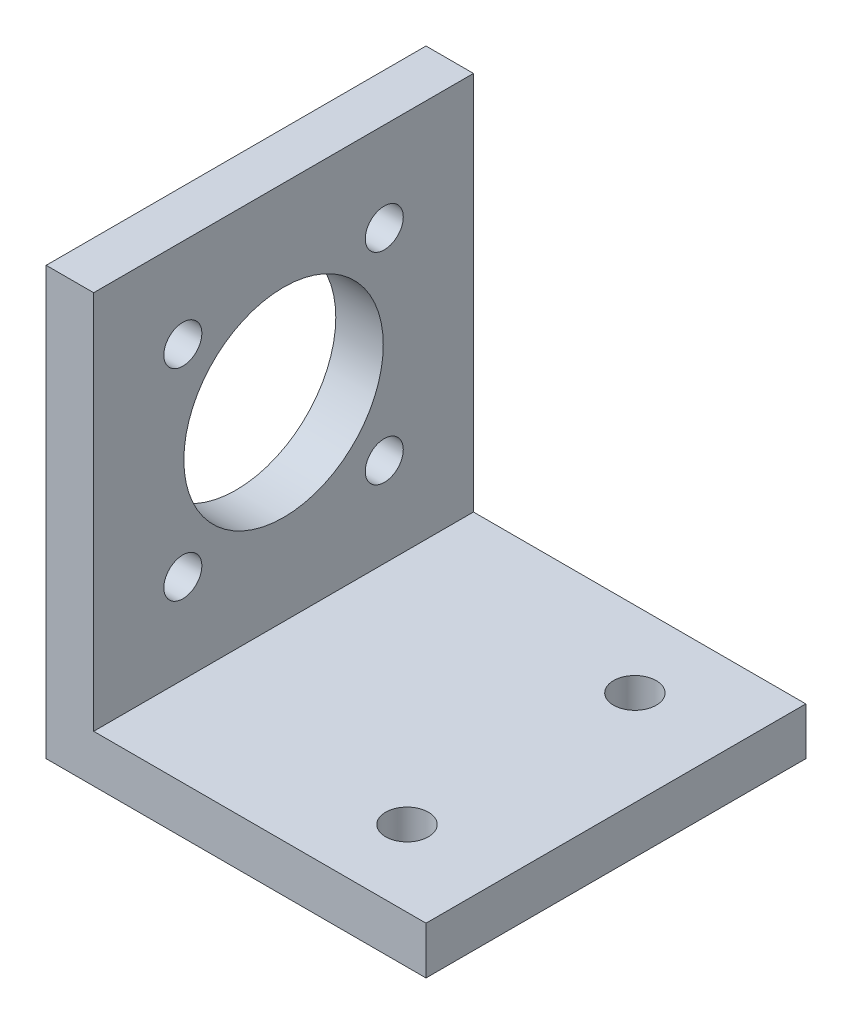
ISO-10303-21;
HEADER;
FILE_DESCRIPTION(('STEP AP214'),'2;1');
FILE_NAME('part.step','',(''),(''),'','','');
FILE_SCHEMA(('AUTOMOTIVE_DESIGN { 1 0 10303 214 1 1 1 1 }'));
ENDSEC;
DATA;
#1=APPLICATION_CONTEXT('core data for automotive mechanical design processes');
#2=APPLICATION_PROTOCOL_DEFINITION('international standard','automotive_design',2000,#1);
#3=PRODUCT_CONTEXT('',#1,'mechanical');
#4=PRODUCT('Part','Part','',(#3));
#5=PRODUCT_RELATED_PRODUCT_CATEGORY('part','',(#4));
#6=PRODUCT_DEFINITION_FORMATION('','',#4);
#7=PRODUCT_DEFINITION_CONTEXT('part definition',#1,'design');
#8=PRODUCT_DEFINITION('design','',#6,#7);
#9=PRODUCT_DEFINITION_SHAPE('','',#8);
#10=(LENGTH_UNIT() NAMED_UNIT(*) SI_UNIT(.MILLI.,.METRE.));
#11=(NAMED_UNIT(*) PLANE_ANGLE_UNIT() SI_UNIT($,.RADIAN.));
#12=(NAMED_UNIT(*) SI_UNIT($,.STERADIAN.) SOLID_ANGLE_UNIT());
#13=UNCERTAINTY_MEASURE_WITH_UNIT(LENGTH_MEASURE(1.E-05),#10,'distance_accuracy_value','');
#14=(GEOMETRIC_REPRESENTATION_CONTEXT(3) GLOBAL_UNCERTAINTY_ASSIGNED_CONTEXT((#13)) GLOBAL_UNIT_ASSIGNED_CONTEXT((#10,
#11,#12)) REPRESENTATION_CONTEXT('',''));
#15=CARTESIAN_POINT('',(0.,0.,0.));
#16=DIRECTION('',(0.,0.,1.));
#17=DIRECTION('',(1.,0.,0.));
#18=AXIS2_PLACEMENT_3D('',#15,#16,#17);
#19=CARTESIAN_POINT('',(0.,5.,0.));
#20=DIRECTION('',(0.,-1.,0.));
#21=DIRECTION('',(0.,0.,-1.));
#22=AXIS2_PLACEMENT_3D('',#19,#20,#21);
#23=PLANE('',#22);
#24=CARTESIAN_POINT('',(10.,5.,-12.));
#25=DIRECTION('',(0.,1.,0.));
#26=DIRECTION('',(0.,0.,1.));
#27=AXIS2_PLACEMENT_3D('',#24,#25,#26);
#28=CIRCLE('',#27,2.25);
#29=CARTESIAN_POINT('',(10.,5.,-9.75));
#30=VERTEX_POINT('',#29);
#31=EDGE_CURVE('E157',#30,#30,#28,.T.);
#32=ORIENTED_EDGE('',*,*,#31,.F.);
#33=EDGE_LOOP('',(#32));
#34=FACE_BOUND('',#33,.T.);
#35=CARTESIAN_POINT('',(10.,5.,12.));
#36=DIRECTION('',(0.,1.,0.));
#37=DIRECTION('',(0.,0.,-1.));
#38=AXIS2_PLACEMENT_3D('',#35,#36,#37);
#39=CIRCLE('',#38,2.25);
#40=CARTESIAN_POINT('',(10.,5.,9.75));
#41=VERTEX_POINT('',#40);
#42=EDGE_CURVE('E153',#41,#41,#39,.T.);
#43=ORIENTED_EDGE('',*,*,#42,.F.);
#44=EDGE_LOOP('',(#43));
#45=FACE_BOUND('',#44,.T.);
#46=DIRECTION('',(0.,0.,-1.));
#47=VECTOR('',#46,1.);
#48=CARTESIAN_POINT('',(-15.,5.,-20.));
#49=LINE('',#48,#47);
#50=CARTESIAN_POINT('',(-15.,5.,20.));
#51=VERTEX_POINT('',#50);
#52=CARTESIAN_POINT('',(-15.,5.,-20.));
#53=VERTEX_POINT('',#52);
#54=EDGE_CURVE('E52',#51,#53,#49,.T.);
#55=ORIENTED_EDGE('',*,*,#54,.F.);
#56=DIRECTION('',(1.,0.,0.));
#57=VECTOR('',#56,1.);
#58=CARTESIAN_POINT('',(-20.,5.,20.));
#59=LINE('',#58,#57);
#60=CARTESIAN_POINT('',(20.,5.,20.));
#61=VERTEX_POINT('',#60);
#62=EDGE_CURVE('E57',#51,#61,#59,.T.);
#63=ORIENTED_EDGE('',*,*,#62,.T.);
#64=DIRECTION('',(0.,0.,-1.));
#65=VECTOR('',#64,1.);
#66=CARTESIAN_POINT('',(20.,5.,20.));
#67=LINE('',#66,#65);
#68=CARTESIAN_POINT('',(20.,5.,-20.));
#69=VERTEX_POINT('',#68);
#70=EDGE_CURVE('E88',#61,#69,#67,.T.);
#71=ORIENTED_EDGE('',*,*,#70,.T.);
#72=DIRECTION('',(-1.,0.,0.));
#73=VECTOR('',#72,1.);
#74=CARTESIAN_POINT('',(-20.,5.,-20.));
#75=LINE('',#74,#73);
#76=EDGE_CURVE('E139',#69,#53,#75,.T.);
#77=ORIENTED_EDGE('',*,*,#76,.T.);
#78=EDGE_LOOP('',(#55,#63,#71,#77));
#79=FACE_BOUND('',#78,.T.);
#80=ADVANCED_FACE('F37',(#34,#45,#79),#23,.F.);
#81=CARTESIAN_POINT('',(20.,5.,20.));
#82=DIRECTION('',(-1.,0.,0.));
#83=DIRECTION('',(0.,0.,1.));
#84=AXIS2_PLACEMENT_3D('',#81,#82,#83);
#85=PLANE('',#84);
#86=DIRECTION('',(0.,0.,-1.));
#87=VECTOR('',#86,1.);
#88=CARTESIAN_POINT('',(20.,0.,20.));
#89=LINE('',#88,#87);
#90=CARTESIAN_POINT('',(20.,0.,20.));
#91=VERTEX_POINT('',#90);
#92=CARTESIAN_POINT('',(20.,0.,-20.));
#93=VERTEX_POINT('',#92);
#94=EDGE_CURVE('E94',#91,#93,#89,.T.);
#95=ORIENTED_EDGE('',*,*,#94,.T.);
#96=DIRECTION('',(0.,-1.,0.));
#97=VECTOR('',#96,1.);
#98=CARTESIAN_POINT('',(20.,5.,-20.));
#99=LINE('',#98,#97);
#100=EDGE_CURVE('E11',#69,#93,#99,.T.);
#101=ORIENTED_EDGE('',*,*,#100,.F.);
#102=ORIENTED_EDGE('',*,*,#70,.F.);
#103=DIRECTION('',(0.,-1.,0.));
#104=VECTOR('',#103,1.);
#105=CARTESIAN_POINT('',(20.,5.,20.));
#106=LINE('',#105,#104);
#107=EDGE_CURVE('E80',#61,#91,#106,.T.);
#108=ORIENTED_EDGE('',*,*,#107,.T.);
#109=EDGE_LOOP('',(#95,#101,#102,#108));
#110=FACE_BOUND('',#109,.T.);
#111=ADVANCED_FACE('F39',(#110),#85,.F.);
#112=CARTESIAN_POINT('',(-20.,5.,-20.));
#113=DIRECTION('',(0.,0.,1.));
#114=DIRECTION('',(1.,0.,0.));
#115=AXIS2_PLACEMENT_3D('',#112,#113,#114);
#116=PLANE('',#115);
#117=DIRECTION('',(-1.,0.,0.));
#118=VECTOR('',#117,1.);
#119=CARTESIAN_POINT('',(-20.,0.,-20.));
#120=LINE('',#119,#118);
#121=CARTESIAN_POINT('',(-20.,0.,-20.));
#122=VERTEX_POINT('',#121);
#123=EDGE_CURVE('E97',#93,#122,#120,.T.);
#124=ORIENTED_EDGE('',*,*,#123,.T.);
#125=DIRECTION('',(0.,-1.,0.));
#126=VECTOR('',#125,1.);
#127=CARTESIAN_POINT('',(-20.,5.,-20.));
#128=LINE('',#127,#126);
#129=CARTESIAN_POINT('',(-20.,45.,-20.));
#130=VERTEX_POINT('',#129);
#131=EDGE_CURVE('E45',#130,#122,#128,.T.);
#132=ORIENTED_EDGE('',*,*,#131,.F.);
#133=DIRECTION('',(-1.,0.,0.));
#134=VECTOR('',#133,1.);
#135=CARTESIAN_POINT('',(-20.,45.,-20.));
#136=LINE('',#135,#134);
#137=CARTESIAN_POINT('',(-15.,45.,-20.));
#138=VERTEX_POINT('',#137);
#139=EDGE_CURVE('E121',#138,#130,#136,.T.);
#140=ORIENTED_EDGE('',*,*,#139,.F.);
#141=DIRECTION('',(0.,-1.,0.));
#142=VECTOR('',#141,1.);
#143=CARTESIAN_POINT('',(-15.,45.,-20.));
#144=LINE('',#143,#142);
#145=EDGE_CURVE('E102',#138,#53,#144,.T.);
#146=ORIENTED_EDGE('',*,*,#145,.T.);
#147=ORIENTED_EDGE('',*,*,#76,.F.);
#148=ORIENTED_EDGE('',*,*,#100,.T.);
#149=EDGE_LOOP('',(#124,#132,#140,#146,#147,#148));
#150=FACE_BOUND('',#149,.T.);
#151=ADVANCED_FACE('F118',(#150),#116,.F.);
#152=CARTESIAN_POINT('',(-20.,5.,20.));
#153=DIRECTION('',(1.,0.,0.));
#154=DIRECTION('',(0.,0.,-1.));
#155=AXIS2_PLACEMENT_3D('',#152,#153,#154);
#156=PLANE('',#155);
#157=CARTESIAN_POINT('',(-20.,35.6066017177982,-10.6066017177982));
#158=DIRECTION('',(1.,0.,0.));
#159=DIRECTION('',(0.,0.,-1.));
#160=AXIS2_PLACEMENT_3D('',#157,#158,#159);
#161=CIRCLE('',#160,2.);
#162=CARTESIAN_POINT('',(-20.,35.6066017177982,-12.6066017177982));
#163=VERTEX_POINT('',#162);
#164=EDGE_CURVE('E175',#163,#163,#161,.T.);
#165=ORIENTED_EDGE('',*,*,#164,.T.);
#166=EDGE_LOOP('',(#165));
#167=FACE_BOUND('',#166,.T.);
#168=CARTESIAN_POINT('',(-20.,14.3933982822018,-10.6066017177982));
#169=DIRECTION('',(1.,0.,0.));
#170=DIRECTION('',(0.,0.,-1.));
#171=AXIS2_PLACEMENT_3D('',#168,#169,#170);
#172=CIRCLE('',#171,2.);
#173=CARTESIAN_POINT('',(-20.,14.3933982822018,-12.6066017177982));
#174=VERTEX_POINT('',#173);
#175=EDGE_CURVE('E168',#174,#174,#172,.T.);
#176=ORIENTED_EDGE('',*,*,#175,.T.);
#177=EDGE_LOOP('',(#176));
#178=FACE_BOUND('',#177,.T.);
#179=CARTESIAN_POINT('',(-20.,25.,0.));
#180=DIRECTION('',(1.,0.,0.));
#181=DIRECTION('',(0.,0.,-1.));
#182=AXIS2_PLACEMENT_3D('',#179,#180,#181);
#183=CIRCLE('',#182,10.5);
#184=CARTESIAN_POINT('',(-20.,25.,-10.5));
#185=VERTEX_POINT('',#184);
#186=EDGE_CURVE('E186',#185,#185,#183,.T.);
#187=ORIENTED_EDGE('',*,*,#186,.T.);
#188=EDGE_LOOP('',(#187));
#189=FACE_BOUND('',#188,.T.);
#190=CARTESIAN_POINT('',(-20.,14.3933982822018,10.6066017177982));
#191=DIRECTION('',(1.,0.,0.));
#192=DIRECTION('',(0.,0.,-1.));
#193=AXIS2_PLACEMENT_3D('',#190,#191,#192);
#194=CIRCLE('',#193,2.);
#195=CARTESIAN_POINT('',(-20.,14.3933982822018,8.60660171779822));
#196=VERTEX_POINT('',#195);
#197=EDGE_CURVE('E180',#196,#196,#194,.T.);
#198=ORIENTED_EDGE('',*,*,#197,.T.);
#199=EDGE_LOOP('',(#198));
#200=FACE_BOUND('',#199,.T.);
#201=CARTESIAN_POINT('',(-20.,35.6066017177982,10.6066017177982));
#202=DIRECTION('',(1.,0.,0.));
#203=DIRECTION('',(0.,0.,-1.));
#204=AXIS2_PLACEMENT_3D('',#201,#202,#203);
#205=CIRCLE('',#204,2.);
#206=CARTESIAN_POINT('',(-20.,35.6066017177982,8.60660171779822));
#207=VERTEX_POINT('',#206);
#208=EDGE_CURVE('E154',#207,#207,#205,.T.);
#209=ORIENTED_EDGE('',*,*,#208,.T.);
#210=EDGE_LOOP('',(#209));
#211=FACE_BOUND('',#210,.T.);
#212=DIRECTION('',(0.,0.,1.));
#213=VECTOR('',#212,1.);
#214=CARTESIAN_POINT('',(-20.,0.,20.));
#215=LINE('',#214,#213);
#216=CARTESIAN_POINT('',(-20.,0.,20.));
#217=VERTEX_POINT('',#216);
#218=EDGE_CURVE('E89',#122,#217,#215,.T.);
#219=ORIENTED_EDGE('',*,*,#218,.T.);
#220=DIRECTION('',(0.,-1.,0.));
#221=VECTOR('',#220,1.);
#222=CARTESIAN_POINT('',(-20.,5.,20.));
#223=LINE('',#222,#221);
#224=CARTESIAN_POINT('',(-20.,45.,20.));
#225=VERTEX_POINT('',#224);
#226=EDGE_CURVE('E84',#225,#217,#223,.T.);
#227=ORIENTED_EDGE('',*,*,#226,.F.);
#228=DIRECTION('',(0.,0.,1.));
#229=VECTOR('',#228,1.);
#230=CARTESIAN_POINT('',(-20.,45.,-20.));
#231=LINE('',#230,#229);
#232=EDGE_CURVE('E114',#130,#225,#231,.T.);
#233=ORIENTED_EDGE('',*,*,#232,.F.);
#234=ORIENTED_EDGE('',*,*,#131,.T.);
#235=EDGE_LOOP('',(#219,#227,#233,#234));
#236=FACE_BOUND('',#235,.T.);
#237=ADVANCED_FACE('F112',(#167,#178,#189,#200,#211,#236),#156,.F.);
#238=CARTESIAN_POINT('',(-20.,5.,20.));
#239=DIRECTION('',(0.,0.,-1.));
#240=DIRECTION('',(-1.,0.,0.));
#241=AXIS2_PLACEMENT_3D('',#238,#239,#240);
#242=PLANE('',#241);
#243=DIRECTION('',(1.,0.,0.));
#244=VECTOR('',#243,1.);
#245=CARTESIAN_POINT('',(-20.,0.,20.));
#246=LINE('',#245,#244);
#247=EDGE_CURVE('E77',#217,#91,#246,.T.);
#248=ORIENTED_EDGE('',*,*,#247,.T.);
#249=ORIENTED_EDGE('',*,*,#107,.F.);
#250=ORIENTED_EDGE('',*,*,#62,.F.);
#251=DIRECTION('',(0.,-1.,0.));
#252=VECTOR('',#251,1.);
#253=CARTESIAN_POINT('',(-15.,45.,20.));
#254=LINE('',#253,#252);
#255=CARTESIAN_POINT('',(-15.,45.,20.));
#256=VERTEX_POINT('',#255);
#257=EDGE_CURVE('E98',#256,#51,#254,.T.);
#258=ORIENTED_EDGE('',*,*,#257,.F.);
#259=DIRECTION('',(1.,0.,0.));
#260=VECTOR('',#259,1.);
#261=CARTESIAN_POINT('',(-20.,45.,20.));
#262=LINE('',#261,#260);
#263=EDGE_CURVE('E133',#225,#256,#262,.T.);
#264=ORIENTED_EDGE('',*,*,#263,.F.);
#265=ORIENTED_EDGE('',*,*,#226,.T.);
#266=EDGE_LOOP('',(#248,#249,#250,#258,#264,#265));
#267=FACE_BOUND('',#266,.T.);
#268=ADVANCED_FACE('F79',(#267),#242,.F.);
#269=CARTESIAN_POINT('',(0.,0.,0.));
#270=DIRECTION('',(0.,-1.,0.));
#271=DIRECTION('',(0.,0.,-1.));
#272=AXIS2_PLACEMENT_3D('',#269,#270,#271);
#273=PLANE('',#272);
#274=CARTESIAN_POINT('',(10.,0.,-12.));
#275=DIRECTION('',(0.,1.,0.));
#276=DIRECTION('',(0.,0.,1.));
#277=AXIS2_PLACEMENT_3D('',#274,#275,#276);
#278=CIRCLE('',#277,2.25);
#279=CARTESIAN_POINT('',(10.,0.,-9.75));
#280=VERTEX_POINT('',#279);
#281=EDGE_CURVE('E137',#280,#280,#278,.T.);
#282=ORIENTED_EDGE('',*,*,#281,.T.);
#283=EDGE_LOOP('',(#282));
#284=FACE_BOUND('',#283,.T.);
#285=CARTESIAN_POINT('',(10.,0.,12.));
#286=DIRECTION('',(0.,1.,0.));
#287=DIRECTION('',(0.,0.,-1.));
#288=AXIS2_PLACEMENT_3D('',#285,#286,#287);
#289=CIRCLE('',#288,2.25);
#290=CARTESIAN_POINT('',(10.,0.,9.75));
#291=VERTEX_POINT('',#290);
#292=EDGE_CURVE('E150',#291,#291,#289,.T.);
#293=ORIENTED_EDGE('',*,*,#292,.T.);
#294=EDGE_LOOP('',(#293));
#295=FACE_BOUND('',#294,.T.);
#296=ORIENTED_EDGE('',*,*,#94,.F.);
#297=ORIENTED_EDGE('',*,*,#247,.F.);
#298=ORIENTED_EDGE('',*,*,#218,.F.);
#299=ORIENTED_EDGE('',*,*,#123,.F.);
#300=EDGE_LOOP('',(#296,#297,#298,#299));
#301=FACE_BOUND('',#300,.T.);
#302=ADVANCED_FACE('F96',(#284,#295,#301),#273,.T.);
#303=CARTESIAN_POINT('',(-15.,45.,-20.));
#304=DIRECTION('',(-1.,0.,0.));
#305=DIRECTION('',(0.,0.,1.));
#306=AXIS2_PLACEMENT_3D('',#303,#304,#305);
#307=PLANE('',#306);
#308=CARTESIAN_POINT('',(-15.,35.6066017177982,-10.6066017177982));
#309=DIRECTION('',(1.,0.,0.));
#310=DIRECTION('',(0.,0.,-1.));
#311=AXIS2_PLACEMENT_3D('',#308,#309,#310);
#312=CIRCLE('',#311,2.);
#313=CARTESIAN_POINT('',(-15.,35.6066017177982,-12.6066017177982));
#314=VERTEX_POINT('',#313);
#315=EDGE_CURVE('E165',#314,#314,#312,.T.);
#316=ORIENTED_EDGE('',*,*,#315,.F.);
#317=EDGE_LOOP('',(#316));
#318=FACE_BOUND('',#317,.T.);
#319=CARTESIAN_POINT('',(-15.,14.3933982822018,-10.6066017177982));
#320=DIRECTION('',(1.,0.,0.));
#321=DIRECTION('',(0.,0.,-1.));
#322=AXIS2_PLACEMENT_3D('',#319,#320,#321);
#323=CIRCLE('',#322,2.);
#324=CARTESIAN_POINT('',(-15.,14.3933982822018,-12.6066017177982));
#325=VERTEX_POINT('',#324);
#326=EDGE_CURVE('E171',#325,#325,#323,.T.);
#327=ORIENTED_EDGE('',*,*,#326,.F.);
#328=EDGE_LOOP('',(#327));
#329=FACE_BOUND('',#328,.T.);
#330=CARTESIAN_POINT('',(-15.,25.,0.));
#331=DIRECTION('',(1.,0.,0.));
#332=DIRECTION('',(0.,0.,-1.));
#333=AXIS2_PLACEMENT_3D('',#330,#331,#332);
#334=CIRCLE('',#333,10.5);
#335=CARTESIAN_POINT('',(-15.,25.,-10.5));
#336=VERTEX_POINT('',#335);
#337=EDGE_CURVE('E183',#336,#336,#334,.T.);
#338=ORIENTED_EDGE('',*,*,#337,.F.);
#339=EDGE_LOOP('',(#338));
#340=FACE_BOUND('',#339,.T.);
#341=CARTESIAN_POINT('',(-15.,14.3933982822018,10.6066017177982));
#342=DIRECTION('',(1.,0.,0.));
#343=DIRECTION('',(0.,0.,-1.));
#344=AXIS2_PLACEMENT_3D('',#341,#342,#343);
#345=CIRCLE('',#344,2.);
#346=CARTESIAN_POINT('',(-15.,14.3933982822018,8.60660171779822));
#347=VERTEX_POINT('',#346);
#348=EDGE_CURVE('E172',#347,#347,#345,.T.);
#349=ORIENTED_EDGE('',*,*,#348,.F.);
#350=EDGE_LOOP('',(#349));
#351=FACE_BOUND('',#350,.T.);
#352=CARTESIAN_POINT('',(-15.,35.6066017177982,10.6066017177982));
#353=DIRECTION('',(1.,0.,0.));
#354=DIRECTION('',(0.,0.,-1.));
#355=AXIS2_PLACEMENT_3D('',#352,#353,#354);
#356=CIRCLE('',#355,2.);
#357=CARTESIAN_POINT('',(-15.,35.6066017177982,8.60660171779822));
#358=VERTEX_POINT('',#357);
#359=EDGE_CURVE('E162',#358,#358,#356,.T.);
#360=ORIENTED_EDGE('',*,*,#359,.F.);
#361=EDGE_LOOP('',(#360));
#362=FACE_BOUND('',#361,.T.);
#363=ORIENTED_EDGE('',*,*,#54,.T.);
#364=ORIENTED_EDGE('',*,*,#145,.F.);
#365=DIRECTION('',(0.,0.,-1.));
#366=VECTOR('',#365,1.);
#367=CARTESIAN_POINT('',(-15.,45.,-20.));
#368=LINE('',#367,#366);
#369=EDGE_CURVE('E129',#256,#138,#368,.T.);
#370=ORIENTED_EDGE('',*,*,#369,.F.);
#371=ORIENTED_EDGE('',*,*,#257,.T.);
#372=EDGE_LOOP('',(#363,#364,#370,#371));
#373=FACE_BOUND('',#372,.T.);
#374=ADVANCED_FACE('F142',(#318,#329,#340,#351,#362,#373),#307,.F.);
#375=CARTESIAN_POINT('',(0.,45.,0.));
#376=DIRECTION('',(0.,1.,0.));
#377=DIRECTION('',(0.,0.,1.));
#378=AXIS2_PLACEMENT_3D('',#375,#376,#377);
#379=PLANE('',#378);
#380=ORIENTED_EDGE('',*,*,#232,.T.);
#381=ORIENTED_EDGE('',*,*,#263,.T.);
#382=ORIENTED_EDGE('',*,*,#369,.T.);
#383=ORIENTED_EDGE('',*,*,#139,.T.);
#384=EDGE_LOOP('',(#380,#381,#382,#383));
#385=FACE_BOUND('',#384,.T.);
#386=ADVANCED_FACE('F125',(#385),#379,.T.);
#387=CARTESIAN_POINT('',(10.,0.,12.));
#388=DIRECTION('',(0.,1.,0.));
#389=DIRECTION('',(0.,0.,1.));
#390=AXIS2_PLACEMENT_3D('',#387,#388,#389);
#391=CYLINDRICAL_SURFACE('',#390,2.25);
#392=ORIENTED_EDGE('',*,*,#292,.F.);
#393=EDGE_LOOP('',(#392));
#394=FACE_BOUND('',#393,.T.);
#395=ORIENTED_EDGE('',*,*,#42,.T.);
#396=EDGE_LOOP('',(#395));
#397=FACE_BOUND('',#396,.T.);
#398=ADVANCED_FACE('F214',(#394,#397),#391,.F.);
#399=CARTESIAN_POINT('',(10.,0.,-12.));
#400=DIRECTION('',(0.,1.,0.));
#401=DIRECTION('',(0.,0.,1.));
#402=AXIS2_PLACEMENT_3D('',#399,#400,#401);
#403=CYLINDRICAL_SURFACE('',#402,2.25);
#404=ORIENTED_EDGE('',*,*,#281,.F.);
#405=EDGE_LOOP('',(#404));
#406=FACE_BOUND('',#405,.T.);
#407=ORIENTED_EDGE('',*,*,#31,.T.);
#408=EDGE_LOOP('',(#407));
#409=FACE_BOUND('',#408,.T.);
#410=ADVANCED_FACE('F205',(#406,#409),#403,.F.);
#411=CARTESIAN_POINT('',(-20.,35.6066017177982,10.6066017177982));
#412=DIRECTION('',(1.,0.,0.));
#413=DIRECTION('',(0.,0.,-1.));
#414=AXIS2_PLACEMENT_3D('',#411,#412,#413);
#415=CYLINDRICAL_SURFACE('',#414,2.);
#416=ORIENTED_EDGE('',*,*,#208,.F.);
#417=EDGE_LOOP('',(#416));
#418=FACE_BOUND('',#417,.T.);
#419=ORIENTED_EDGE('',*,*,#359,.T.);
#420=EDGE_LOOP('',(#419));
#421=FACE_BOUND('',#420,.T.);
#422=ADVANCED_FACE('F202',(#418,#421),#415,.F.);
#423=CARTESIAN_POINT('',(-20.,14.3933982822018,10.6066017177982));
#424=DIRECTION('',(1.,0.,0.));
#425=DIRECTION('',(0.,0.,-1.));
#426=AXIS2_PLACEMENT_3D('',#423,#424,#425);
#427=CYLINDRICAL_SURFACE('',#426,2.);
#428=ORIENTED_EDGE('',*,*,#197,.F.);
#429=EDGE_LOOP('',(#428));
#430=FACE_BOUND('',#429,.T.);
#431=ORIENTED_EDGE('',*,*,#348,.T.);
#432=EDGE_LOOP('',(#431));
#433=FACE_BOUND('',#432,.T.);
#434=ADVANCED_FACE('F204',(#430,#433),#427,.F.);
#435=CARTESIAN_POINT('',(-20.,25.,0.));
#436=DIRECTION('',(1.,0.,0.));
#437=DIRECTION('',(0.,0.,-1.));
#438=AXIS2_PLACEMENT_3D('',#435,#436,#437);
#439=CYLINDRICAL_SURFACE('',#438,10.5);
#440=ORIENTED_EDGE('',*,*,#186,.F.);
#441=EDGE_LOOP('',(#440));
#442=FACE_BOUND('',#441,.T.);
#443=ORIENTED_EDGE('',*,*,#337,.T.);
#444=EDGE_LOOP('',(#443));
#445=FACE_BOUND('',#444,.T.);
#446=ADVANCED_FACE('F192',(#442,#445),#439,.F.);
#447=CARTESIAN_POINT('',(-20.,14.3933982822018,-10.6066017177982));
#448=DIRECTION('',(1.,0.,0.));
#449=DIRECTION('',(0.,0.,-1.));
#450=AXIS2_PLACEMENT_3D('',#447,#448,#449);
#451=CYLINDRICAL_SURFACE('',#450,2.);
#452=ORIENTED_EDGE('',*,*,#175,.F.);
#453=EDGE_LOOP('',(#452));
#454=FACE_BOUND('',#453,.T.);
#455=ORIENTED_EDGE('',*,*,#326,.T.);
#456=EDGE_LOOP('',(#455));
#457=FACE_BOUND('',#456,.T.);
#458=ADVANCED_FACE('F302',(#454,#457),#451,.F.);
#459=CARTESIAN_POINT('',(-20.,35.6066017177982,-10.6066017177982));
#460=DIRECTION('',(1.,0.,0.));
#461=DIRECTION('',(0.,0.,-1.));
#462=AXIS2_PLACEMENT_3D('',#459,#460,#461);
#463=CYLINDRICAL_SURFACE('',#462,2.);
#464=ORIENTED_EDGE('',*,*,#164,.F.);
#465=EDGE_LOOP('',(#464));
#466=FACE_BOUND('',#465,.T.);
#467=ORIENTED_EDGE('',*,*,#315,.T.);
#468=EDGE_LOOP('',(#467));
#469=FACE_BOUND('',#468,.T.);
#470=ADVANCED_FACE('F313',(#466,#469),#463,.F.);
#471=CLOSED_SHELL('',(#80,#111,#151,#237,#268,#302,#374,#386,#398,#410,#422,#434,#446,#458,#470));
#472=MANIFOLD_SOLID_BREP('B2',#471);
#473=ADVANCED_BREP_SHAPE_REPRESENTATION('',(#18,#472),#14);
#474=SHAPE_DEFINITION_REPRESENTATION(#9,#473);
ENDSEC;
END-ISO-10303-21;
